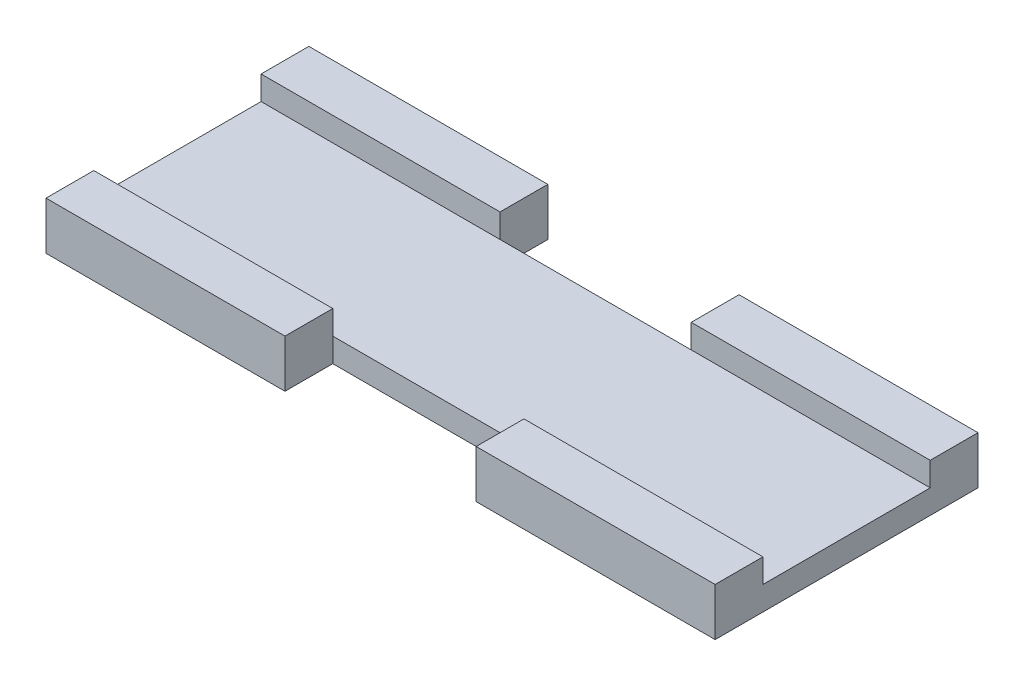
ISO-10303-21;
HEADER;
FILE_DESCRIPTION(('STEP AP214'),'2;1');
FILE_NAME('part.step','',(''),(''),'','','');
FILE_SCHEMA(('AUTOMOTIVE_DESIGN { 1 0 10303 214 1 1 1 1 }'));
ENDSEC;
DATA;
#1=APPLICATION_CONTEXT('core data for automotive mechanical design processes');
#2=APPLICATION_PROTOCOL_DEFINITION('international standard','automotive_design',2000,#1);
#3=PRODUCT_CONTEXT('',#1,'mechanical');
#4=PRODUCT('Part','Part','',(#3));
#5=PRODUCT_RELATED_PRODUCT_CATEGORY('part','',(#4));
#6=PRODUCT_DEFINITION_FORMATION('','',#4);
#7=PRODUCT_DEFINITION_CONTEXT('part definition',#1,'design');
#8=PRODUCT_DEFINITION('design','',#6,#7);
#9=PRODUCT_DEFINITION_SHAPE('','',#8);
#10=(LENGTH_UNIT() NAMED_UNIT(*) SI_UNIT(.MILLI.,.METRE.));
#11=(NAMED_UNIT(*) PLANE_ANGLE_UNIT() SI_UNIT($,.RADIAN.));
#12=(NAMED_UNIT(*) SI_UNIT($,.STERADIAN.) SOLID_ANGLE_UNIT());
#13=UNCERTAINTY_MEASURE_WITH_UNIT(LENGTH_MEASURE(1.E-05),#10,'distance_accuracy_value','');
#14=(GEOMETRIC_REPRESENTATION_CONTEXT(3) GLOBAL_UNCERTAINTY_ASSIGNED_CONTEXT((#13)) GLOBAL_UNIT_ASSIGNED_CONTEXT((#10,
#11,#12)) REPRESENTATION_CONTEXT('',''));
#15=CARTESIAN_POINT('',(0.,0.,0.));
#16=DIRECTION('',(0.,0.,1.));
#17=DIRECTION('',(1.,0.,0.));
#18=AXIS2_PLACEMENT_3D('',#15,#16,#17);
#19=CARTESIAN_POINT('',(0.,5.,17.5));
#20=DIRECTION('',(0.,0.,1.));
#21=DIRECTION('',(1.,0.,0.));
#22=AXIS2_PLACEMENT_3D('',#19,#20,#21);
#23=PLANE('',#22);
#24=DIRECTION('',(0.,-1.,0.));
#25=VECTOR('',#24,1.);
#26=CARTESIAN_POINT('',(20.,10.,17.5));
#27=LINE('',#26,#25);
#28=CARTESIAN_POINT('',(20.,5.,17.5));
#29=VERTEX_POINT('',#28);
#30=CARTESIAN_POINT('',(20.,0.,17.5));
#31=VERTEX_POINT('',#30);
#32=EDGE_CURVE('E192',#29,#31,#27,.T.);
#33=ORIENTED_EDGE('',*,*,#32,.F.);
#34=DIRECTION('',(-1.,0.,0.));
#35=VECTOR('',#34,1.);
#36=CARTESIAN_POINT('',(0.,5.,17.5));
#37=LINE('',#36,#35);
#38=CARTESIAN_POINT('',(-20.,5.,17.5));
#39=VERTEX_POINT('',#38);
#40=EDGE_CURVE('E284',#29,#39,#37,.T.);
#41=ORIENTED_EDGE('',*,*,#40,.T.);
#42=DIRECTION('',(0.,-1.,0.));
#43=VECTOR('',#42,1.);
#44=CARTESIAN_POINT('',(-20.,10.,17.5));
#45=LINE('',#44,#43);
#46=CARTESIAN_POINT('',(-20.,0.,17.5));
#47=VERTEX_POINT('',#46);
#48=EDGE_CURVE('E11',#39,#47,#45,.T.);
#49=ORIENTED_EDGE('',*,*,#48,.T.);
#50=DIRECTION('',(-1.,0.,0.));
#51=VECTOR('',#50,1.);
#52=CARTESIAN_POINT('',(0.,0.,17.5));
#53=LINE('',#52,#51);
#54=EDGE_CURVE('E59',#31,#47,#53,.T.);
#55=ORIENTED_EDGE('',*,*,#54,.F.);
#56=EDGE_LOOP('',(#33,#41,#49,#55));
#57=FACE_BOUND('',#56,.T.);
#58=ADVANCED_FACE('F37',(#57),#23,.T.);
#59=CARTESIAN_POINT('',(0.,5.,-17.5));
#60=DIRECTION('',(0.,0.,-1.));
#61=DIRECTION('',(-1.,0.,0.));
#62=AXIS2_PLACEMENT_3D('',#59,#60,#61);
#63=PLANE('',#62);
#64=DIRECTION('',(1.,0.,0.));
#65=VECTOR('',#64,1.);
#66=CARTESIAN_POINT('',(0.,5.,-17.5));
#67=LINE('',#66,#65);
#68=CARTESIAN_POINT('',(-20.,5.,-17.5));
#69=VERTEX_POINT('',#68);
#70=CARTESIAN_POINT('',(20.,5.,-17.5));
#71=VERTEX_POINT('',#70);
#72=EDGE_CURVE('E288',#69,#71,#67,.T.);
#73=ORIENTED_EDGE('',*,*,#72,.T.);
#74=DIRECTION('',(0.,-1.,0.));
#75=VECTOR('',#74,1.);
#76=CARTESIAN_POINT('',(20.,10.,-17.5));
#77=LINE('',#76,#75);
#78=CARTESIAN_POINT('',(20.,0.,-17.5));
#79=VERTEX_POINT('',#78);
#80=EDGE_CURVE('E243',#71,#79,#77,.T.);
#81=ORIENTED_EDGE('',*,*,#80,.T.);
#82=DIRECTION('',(1.,0.,0.));
#83=VECTOR('',#82,1.);
#84=CARTESIAN_POINT('',(0.,0.,-17.5));
#85=LINE('',#84,#83);
#86=CARTESIAN_POINT('',(-20.,0.,-17.5));
#87=VERTEX_POINT('',#86);
#88=EDGE_CURVE('E297',#87,#79,#85,.T.);
#89=ORIENTED_EDGE('',*,*,#88,.F.);
#90=DIRECTION('',(0.,-1.,0.));
#91=VECTOR('',#90,1.);
#92=CARTESIAN_POINT('',(-20.,10.,-17.5));
#93=LINE('',#92,#91);
#94=EDGE_CURVE('E45',#69,#87,#93,.T.);
#95=ORIENTED_EDGE('',*,*,#94,.F.);
#96=EDGE_LOOP('',(#73,#81,#89,#95));
#97=FACE_BOUND('',#96,.T.);
#98=ADVANCED_FACE('F340',(#97),#63,.T.);
#99=CARTESIAN_POINT('',(70.,5.,0.));
#100=DIRECTION('',(1.,0.,0.));
#101=DIRECTION('',(0.,0.,-1.));
#102=AXIS2_PLACEMENT_3D('',#99,#100,#101);
#103=PLANE('',#102);
#104=DIRECTION('',(0.,0.,1.));
#105=VECTOR('',#104,1.);
#106=CARTESIAN_POINT('',(70.,0.,0.));
#107=LINE('',#106,#105);
#108=CARTESIAN_POINT('',(70.,0.,-27.5));
#109=VERTEX_POINT('',#108);
#110=CARTESIAN_POINT('',(70.,0.,27.5));
#111=VERTEX_POINT('',#110);
#112=EDGE_CURVE('E296',#109,#111,#107,.T.);
#113=ORIENTED_EDGE('',*,*,#112,.F.);
#114=DIRECTION('',(0.,-1.,0.));
#115=VECTOR('',#114,1.);
#116=CARTESIAN_POINT('',(70.,10.,-27.5));
#117=LINE('',#116,#115);
#118=CARTESIAN_POINT('',(70.,10.,-27.5));
#119=VERTEX_POINT('',#118);
#120=EDGE_CURVE('E234',#119,#109,#117,.T.);
#121=ORIENTED_EDGE('',*,*,#120,.F.);
#122=DIRECTION('',(0.,0.,-1.));
#123=VECTOR('',#122,1.);
#124=CARTESIAN_POINT('',(70.,10.,0.));
#125=LINE('',#124,#123);
#126=CARTESIAN_POINT('',(70.,10.,-17.5));
#127=VERTEX_POINT('',#126);
#128=EDGE_CURVE('E232',#127,#119,#125,.T.);
#129=ORIENTED_EDGE('',*,*,#128,.F.);
#130=DIRECTION('',(0.,-1.,0.));
#131=VECTOR('',#130,1.);
#132=CARTESIAN_POINT('',(70.,10.,-17.5));
#133=LINE('',#132,#131);
#134=CARTESIAN_POINT('',(70.,5.,-17.5));
#135=VERTEX_POINT('',#134);
#136=EDGE_CURVE('E240',#127,#135,#133,.T.);
#137=ORIENTED_EDGE('',*,*,#136,.T.);
#138=DIRECTION('',(0.,0.,1.));
#139=VECTOR('',#138,1.);
#140=CARTESIAN_POINT('',(70.,5.,0.));
#141=LINE('',#140,#139);
#142=CARTESIAN_POINT('',(70.,5.,17.5));
#143=VERTEX_POINT('',#142);
#144=EDGE_CURVE('E283',#135,#143,#141,.T.);
#145=ORIENTED_EDGE('',*,*,#144,.T.);
#146=DIRECTION('',(0.,-1.,0.));
#147=VECTOR('',#146,1.);
#148=CARTESIAN_POINT('',(70.,10.,17.5));
#149=LINE('',#148,#147);
#150=CARTESIAN_POINT('',(70.,10.,17.5));
#151=VERTEX_POINT('',#150);
#152=EDGE_CURVE('E197',#151,#143,#149,.T.);
#153=ORIENTED_EDGE('',*,*,#152,.F.);
#154=DIRECTION('',(0.,0.,1.));
#155=VECTOR('',#154,1.);
#156=CARTESIAN_POINT('',(70.,10.,0.));
#157=LINE('',#156,#155);
#158=CARTESIAN_POINT('',(70.,10.,27.5));
#159=VERTEX_POINT('',#158);
#160=EDGE_CURVE('E187',#151,#159,#157,.T.);
#161=ORIENTED_EDGE('',*,*,#160,.T.);
#162=DIRECTION('',(0.,-1.,0.));
#163=VECTOR('',#162,1.);
#164=CARTESIAN_POINT('',(70.,10.,27.5));
#165=LINE('',#164,#163);
#166=EDGE_CURVE('E172',#159,#111,#165,.T.);
#167=ORIENTED_EDGE('',*,*,#166,.T.);
#168=EDGE_LOOP('',(#113,#121,#129,#137,#145,#153,#161,#167));
#169=FACE_BOUND('',#168,.T.);
#170=ADVANCED_FACE('F350',(#169),#103,.T.);
#171=CARTESIAN_POINT('',(-70.,5.,0.));
#172=DIRECTION('',(-1.,0.,0.));
#173=DIRECTION('',(0.,0.,1.));
#174=AXIS2_PLACEMENT_3D('',#171,#172,#173);
#175=PLANE('',#174);
#176=DIRECTION('',(0.,0.,-1.));
#177=VECTOR('',#176,1.);
#178=CARTESIAN_POINT('',(-70.,0.,0.));
#179=LINE('',#178,#177);
#180=CARTESIAN_POINT('',(-70.,0.,27.5));
#181=VERTEX_POINT('',#180);
#182=CARTESIAN_POINT('',(-70.,0.,-27.5));
#183=VERTEX_POINT('',#182);
#184=EDGE_CURVE('E40',#181,#183,#179,.T.);
#185=ORIENTED_EDGE('',*,*,#184,.F.);
#186=DIRECTION('',(0.,-1.,0.));
#187=VECTOR('',#186,1.);
#188=CARTESIAN_POINT('',(-70.,10.,27.5));
#189=LINE('',#188,#187);
#190=CARTESIAN_POINT('',(-70.,10.,27.5));
#191=VERTEX_POINT('',#190);
#192=EDGE_CURVE('E210',#191,#181,#189,.T.);
#193=ORIENTED_EDGE('',*,*,#192,.F.);
#194=DIRECTION('',(0.,0.,1.));
#195=VECTOR('',#194,1.);
#196=CARTESIAN_POINT('',(-70.,10.,0.));
#197=LINE('',#196,#195);
#198=CARTESIAN_POINT('',(-70.,10.,17.5));
#199=VERTEX_POINT('',#198);
#200=EDGE_CURVE('E208',#199,#191,#197,.T.);
#201=ORIENTED_EDGE('',*,*,#200,.F.);
#202=DIRECTION('',(0.,-1.,0.));
#203=VECTOR('',#202,1.);
#204=CARTESIAN_POINT('',(-70.,10.,17.5));
#205=LINE('',#204,#203);
#206=CARTESIAN_POINT('',(-70.,5.,17.5));
#207=VERTEX_POINT('',#206);
#208=EDGE_CURVE('E216',#199,#207,#205,.T.);
#209=ORIENTED_EDGE('',*,*,#208,.T.);
#210=DIRECTION('',(0.,0.,-1.));
#211=VECTOR('',#210,1.);
#212=CARTESIAN_POINT('',(-70.,5.,0.));
#213=LINE('',#212,#211);
#214=CARTESIAN_POINT('',(-70.,5.,-17.5));
#215=VERTEX_POINT('',#214);
#216=EDGE_CURVE('E292',#207,#215,#213,.T.);
#217=ORIENTED_EDGE('',*,*,#216,.T.);
#218=DIRECTION('',(0.,-1.,0.));
#219=VECTOR('',#218,1.);
#220=CARTESIAN_POINT('',(-70.,10.,-17.5));
#221=LINE('',#220,#219);
#222=CARTESIAN_POINT('',(-70.,10.,-17.5));
#223=VERTEX_POINT('',#222);
#224=EDGE_CURVE('E273',#223,#215,#221,.T.);
#225=ORIENTED_EDGE('',*,*,#224,.F.);
#226=DIRECTION('',(0.,0.,-1.));
#227=VECTOR('',#226,1.);
#228=CARTESIAN_POINT('',(-70.,10.,0.));
#229=LINE('',#228,#227);
#230=CARTESIAN_POINT('',(-70.,10.,-27.5));
#231=VERTEX_POINT('',#230);
#232=EDGE_CURVE('E261',#223,#231,#229,.T.);
#233=ORIENTED_EDGE('',*,*,#232,.T.);
#234=DIRECTION('',(0.,-1.,0.));
#235=VECTOR('',#234,1.);
#236=CARTESIAN_POINT('',(-70.,10.,-27.5));
#237=LINE('',#236,#235);
#238=EDGE_CURVE('E276',#231,#183,#237,.T.);
#239=ORIENTED_EDGE('',*,*,#238,.T.);
#240=EDGE_LOOP('',(#185,#193,#201,#209,#217,#225,#233,#239));
#241=FACE_BOUND('',#240,.T.);
#242=ADVANCED_FACE('F318',(#241),#175,.T.);
#243=CARTESIAN_POINT('',(0.,5.,0.));
#244=DIRECTION('',(0.,1.,0.));
#245=DIRECTION('',(0.,0.,1.));
#246=AXIS2_PLACEMENT_3D('',#243,#244,#245);
#247=PLANE('',#246);
#248=EDGE_CURVE('E281',#143,#29,#37,.T.);
#249=ORIENTED_EDGE('',*,*,#248,.F.);
#250=ORIENTED_EDGE('',*,*,#144,.F.);
#251=DIRECTION('',(-1.,0.,0.));
#252=VECTOR('',#251,1.);
#253=CARTESIAN_POINT('',(0.,5.,-17.5));
#254=LINE('',#253,#252);
#255=EDGE_CURVE('E250',#135,#71,#254,.T.);
#256=ORIENTED_EDGE('',*,*,#255,.T.);
#257=ORIENTED_EDGE('',*,*,#72,.F.);
#258=EDGE_CURVE('E289',#215,#69,#67,.T.);
#259=ORIENTED_EDGE('',*,*,#258,.F.);
#260=ORIENTED_EDGE('',*,*,#216,.F.);
#261=EDGE_CURVE('E285',#39,#207,#37,.T.);
#262=ORIENTED_EDGE('',*,*,#261,.F.);
#263=ORIENTED_EDGE('',*,*,#40,.F.);
#264=EDGE_LOOP('',(#249,#250,#256,#257,#259,#260,#262,#263));
#265=FACE_BOUND('',#264,.T.);
#266=ADVANCED_FACE('F315',(#265),#247,.T.);
#267=CARTESIAN_POINT('',(0.,0.,0.));
#268=DIRECTION('',(0.,1.,0.));
#269=DIRECTION('',(0.,0.,1.));
#270=AXIS2_PLACEMENT_3D('',#267,#268,#269);
#271=PLANE('',#270);
#272=ORIENTED_EDGE('',*,*,#112,.T.);
#273=DIRECTION('',(-1.,0.,0.));
#274=VECTOR('',#273,1.);
#275=CARTESIAN_POINT('',(0.,0.,27.5));
#276=LINE('',#275,#274);
#277=CARTESIAN_POINT('',(20.,0.,27.5));
#278=VERTEX_POINT('',#277);
#279=EDGE_CURVE('E183',#111,#278,#276,.T.);
#280=ORIENTED_EDGE('',*,*,#279,.T.);
#281=DIRECTION('',(0.,0.,-1.));
#282=VECTOR('',#281,1.);
#283=CARTESIAN_POINT('',(20.,0.,0.));
#284=LINE('',#283,#282);
#285=EDGE_CURVE('E54',#278,#31,#284,.T.);
#286=ORIENTED_EDGE('',*,*,#285,.T.);
#287=ORIENTED_EDGE('',*,*,#54,.T.);
#288=DIRECTION('',(0.,0.,-1.));
#289=VECTOR('',#288,1.);
#290=CARTESIAN_POINT('',(-20.,0.,0.));
#291=LINE('',#290,#289);
#292=CARTESIAN_POINT('',(-20.,0.,27.5));
#293=VERTEX_POINT('',#292);
#294=EDGE_CURVE('E204',#293,#47,#291,.T.);
#295=ORIENTED_EDGE('',*,*,#294,.F.);
#296=DIRECTION('',(1.,0.,0.));
#297=VECTOR('',#296,1.);
#298=CARTESIAN_POINT('',(0.,0.,27.5));
#299=LINE('',#298,#297);
#300=EDGE_CURVE('E171',#181,#293,#299,.T.);
#301=ORIENTED_EDGE('',*,*,#300,.F.);
#302=ORIENTED_EDGE('',*,*,#184,.T.);
#303=DIRECTION('',(1.,0.,0.));
#304=VECTOR('',#303,1.);
#305=CARTESIAN_POINT('',(0.,0.,-27.5));
#306=LINE('',#305,#304);
#307=CARTESIAN_POINT('',(-20.,0.,-27.5));
#308=VERTEX_POINT('',#307);
#309=EDGE_CURVE('E258',#183,#308,#306,.T.);
#310=ORIENTED_EDGE('',*,*,#309,.T.);
#311=DIRECTION('',(0.,0.,1.));
#312=VECTOR('',#311,1.);
#313=CARTESIAN_POINT('',(-20.,0.,0.));
#314=LINE('',#313,#312);
#315=EDGE_CURVE('E253',#308,#87,#314,.T.);
#316=ORIENTED_EDGE('',*,*,#315,.T.);
#317=ORIENTED_EDGE('',*,*,#88,.T.);
#318=DIRECTION('',(0.,0.,1.));
#319=VECTOR('',#318,1.);
#320=CARTESIAN_POINT('',(20.,0.,0.));
#321=LINE('',#320,#319);
#322=CARTESIAN_POINT('',(20.,0.,-27.5));
#323=VERTEX_POINT('',#322);
#324=EDGE_CURVE('E228',#323,#79,#321,.T.);
#325=ORIENTED_EDGE('',*,*,#324,.F.);
#326=DIRECTION('',(-1.,0.,0.));
#327=VECTOR('',#326,1.);
#328=CARTESIAN_POINT('',(0.,0.,-27.5));
#329=LINE('',#328,#327);
#330=EDGE_CURVE('E223',#109,#323,#329,.T.);
#331=ORIENTED_EDGE('',*,*,#330,.F.);
#332=EDGE_LOOP('',(#272,#280,#286,#287,#295,#301,#302,#310,#316,#317,#325,#331));
#333=FACE_BOUND('',#332,.T.);
#334=ADVANCED_FACE('F334',(#333),#271,.F.);
#335=CARTESIAN_POINT('',(0.,10.,-17.5));
#336=DIRECTION('',(0.,0.,-1.));
#337=DIRECTION('',(-1.,0.,0.));
#338=AXIS2_PLACEMENT_3D('',#335,#336,#337);
#339=PLANE('',#338);
#340=ORIENTED_EDGE('',*,*,#224,.T.);
#341=ORIENTED_EDGE('',*,*,#258,.T.);
#342=CARTESIAN_POINT('',(-20.,10.,-17.5));
#343=VERTEX_POINT('',#342);
#344=EDGE_CURVE('E266',#343,#69,#93,.T.);
#345=ORIENTED_EDGE('',*,*,#344,.F.);
#346=DIRECTION('',(1.,0.,0.));
#347=VECTOR('',#346,1.);
#348=CARTESIAN_POINT('',(0.,10.,-17.5));
#349=LINE('',#348,#347);
#350=EDGE_CURVE('E264',#223,#343,#349,.T.);
#351=ORIENTED_EDGE('',*,*,#350,.F.);
#352=EDGE_LOOP('',(#340,#341,#345,#351));
#353=FACE_BOUND('',#352,.T.);
#354=ADVANCED_FACE('F322',(#353),#339,.F.);
#355=CARTESIAN_POINT('',(-20.,10.,0.));
#356=DIRECTION('',(1.,0.,0.));
#357=DIRECTION('',(0.,0.,-1.));
#358=AXIS2_PLACEMENT_3D('',#355,#356,#357);
#359=PLANE('',#358);
#360=ORIENTED_EDGE('',*,*,#315,.F.);
#361=DIRECTION('',(0.,-1.,0.));
#362=VECTOR('',#361,1.);
#363=CARTESIAN_POINT('',(-20.,10.,-27.5));
#364=LINE('',#363,#362);
#365=CARTESIAN_POINT('',(-20.,10.,-27.5));
#366=VERTEX_POINT('',#365);
#367=EDGE_CURVE('E279',#366,#308,#364,.T.);
#368=ORIENTED_EDGE('',*,*,#367,.F.);
#369=DIRECTION('',(0.,0.,1.));
#370=VECTOR('',#369,1.);
#371=CARTESIAN_POINT('',(-20.,10.,0.));
#372=LINE('',#371,#370);
#373=EDGE_CURVE('E254',#366,#343,#372,.T.);
#374=ORIENTED_EDGE('',*,*,#373,.T.);
#375=ORIENTED_EDGE('',*,*,#344,.T.);
#376=ORIENTED_EDGE('',*,*,#94,.T.);
#377=EDGE_LOOP('',(#360,#368,#374,#375,#376));
#378=FACE_BOUND('',#377,.T.);
#379=ADVANCED_FACE('F337',(#378),#359,.T.);
#380=CARTESIAN_POINT('',(0.,10.,-27.5));
#381=DIRECTION('',(0.,0.,-1.));
#382=DIRECTION('',(-1.,0.,0.));
#383=AXIS2_PLACEMENT_3D('',#380,#381,#382);
#384=PLANE('',#383);
#385=ORIENTED_EDGE('',*,*,#309,.F.);
#386=ORIENTED_EDGE('',*,*,#238,.F.);
#387=DIRECTION('',(1.,0.,0.));
#388=VECTOR('',#387,1.);
#389=CARTESIAN_POINT('',(0.,10.,-27.5));
#390=LINE('',#389,#388);
#391=EDGE_CURVE('E257',#231,#366,#390,.T.);
#392=ORIENTED_EDGE('',*,*,#391,.T.);
#393=ORIENTED_EDGE('',*,*,#367,.T.);
#394=EDGE_LOOP('',(#385,#386,#392,#393));
#395=FACE_BOUND('',#394,.T.);
#396=ADVANCED_FACE('F332',(#395),#384,.T.);
#397=CARTESIAN_POINT('',(0.,10.,0.));
#398=DIRECTION('',(0.,1.,0.));
#399=DIRECTION('',(0.,0.,1.));
#400=AXIS2_PLACEMENT_3D('',#397,#398,#399);
#401=PLANE('',#400);
#402=ORIENTED_EDGE('',*,*,#373,.F.);
#403=ORIENTED_EDGE('',*,*,#391,.F.);
#404=ORIENTED_EDGE('',*,*,#232,.F.);
#405=ORIENTED_EDGE('',*,*,#350,.T.);
#406=EDGE_LOOP('',(#402,#403,#404,#405));
#407=FACE_BOUND('',#406,.T.);
#408=ADVANCED_FACE('F328',(#407),#401,.T.);
#409=CARTESIAN_POINT('',(0.,10.,-27.5));
#410=DIRECTION('',(0.,0.,1.));
#411=DIRECTION('',(1.,0.,0.));
#412=AXIS2_PLACEMENT_3D('',#409,#410,#411);
#413=PLANE('',#412);
#414=ORIENTED_EDGE('',*,*,#330,.T.);
#415=DIRECTION('',(0.,-1.,0.));
#416=VECTOR('',#415,1.);
#417=CARTESIAN_POINT('',(20.,10.,-27.5));
#418=LINE('',#417,#416);
#419=CARTESIAN_POINT('',(20.,10.,-27.5));
#420=VERTEX_POINT('',#419);
#421=EDGE_CURVE('E247',#420,#323,#418,.T.);
#422=ORIENTED_EDGE('',*,*,#421,.F.);
#423=DIRECTION('',(-1.,0.,0.));
#424=VECTOR('',#423,1.);
#425=CARTESIAN_POINT('',(0.,10.,-27.5));
#426=LINE('',#425,#424);
#427=EDGE_CURVE('E224',#119,#420,#426,.T.);
#428=ORIENTED_EDGE('',*,*,#427,.F.);
#429=ORIENTED_EDGE('',*,*,#120,.T.);
#430=EDGE_LOOP('',(#414,#422,#428,#429));
#431=FACE_BOUND('',#430,.T.);
#432=ADVANCED_FACE('F360',(#431),#413,.F.);
#433=CARTESIAN_POINT('',(20.,10.,0.));
#434=DIRECTION('',(1.,0.,0.));
#435=DIRECTION('',(0.,0.,-1.));
#436=AXIS2_PLACEMENT_3D('',#433,#434,#435);
#437=PLANE('',#436);
#438=ORIENTED_EDGE('',*,*,#324,.T.);
#439=ORIENTED_EDGE('',*,*,#80,.F.);
#440=CARTESIAN_POINT('',(20.,10.,-17.5));
#441=VERTEX_POINT('',#440);
#442=EDGE_CURVE('E244',#441,#71,#77,.T.);
#443=ORIENTED_EDGE('',*,*,#442,.F.);
#444=DIRECTION('',(0.,0.,1.));
#445=VECTOR('',#444,1.);
#446=CARTESIAN_POINT('',(20.,10.,0.));
#447=LINE('',#446,#445);
#448=EDGE_CURVE('E227',#420,#441,#447,.T.);
#449=ORIENTED_EDGE('',*,*,#448,.F.);
#450=ORIENTED_EDGE('',*,*,#421,.T.);
#451=EDGE_LOOP('',(#438,#439,#443,#449,#450));
#452=FACE_BOUND('',#451,.T.);
#453=ADVANCED_FACE('F357',(#452),#437,.F.);
#454=CARTESIAN_POINT('',(0.,10.,-17.5));
#455=DIRECTION('',(0.,0.,-1.));
#456=DIRECTION('',(-1.,0.,0.));
#457=AXIS2_PLACEMENT_3D('',#454,#455,#456);
#458=PLANE('',#457);
#459=ORIENTED_EDGE('',*,*,#255,.F.);
#460=ORIENTED_EDGE('',*,*,#136,.F.);
#461=DIRECTION('',(1.,0.,0.));
#462=VECTOR('',#461,1.);
#463=CARTESIAN_POINT('',(0.,10.,-17.5));
#464=LINE('',#463,#462);
#465=EDGE_CURVE('E230',#441,#127,#464,.T.);
#466=ORIENTED_EDGE('',*,*,#465,.F.);
#467=ORIENTED_EDGE('',*,*,#442,.T.);
#468=EDGE_LOOP('',(#459,#460,#466,#467));
#469=FACE_BOUND('',#468,.T.);
#470=ADVANCED_FACE('F345',(#469),#458,.F.);
#471=CARTESIAN_POINT('',(0.,10.,0.));
#472=DIRECTION('',(0.,1.,0.));
#473=DIRECTION('',(0.,0.,1.));
#474=AXIS2_PLACEMENT_3D('',#471,#472,#473);
#475=PLANE('',#474);
#476=ORIENTED_EDGE('',*,*,#427,.T.);
#477=ORIENTED_EDGE('',*,*,#448,.T.);
#478=ORIENTED_EDGE('',*,*,#465,.T.);
#479=ORIENTED_EDGE('',*,*,#128,.T.);
#480=EDGE_LOOP('',(#476,#477,#478,#479));
#481=FACE_BOUND('',#480,.T.);
#482=ADVANCED_FACE('F354',(#481),#475,.T.);
#483=CARTESIAN_POINT('',(0.,10.,17.5));
#484=DIRECTION('',(0.,0.,1.));
#485=DIRECTION('',(1.,0.,0.));
#486=AXIS2_PLACEMENT_3D('',#483,#484,#485);
#487=PLANE('',#486);
#488=CARTESIAN_POINT('',(-20.,10.,17.5));
#489=VERTEX_POINT('',#488);
#490=EDGE_CURVE('E47',#489,#39,#45,.T.);
#491=ORIENTED_EDGE('',*,*,#490,.T.);
#492=ORIENTED_EDGE('',*,*,#261,.T.);
#493=ORIENTED_EDGE('',*,*,#208,.F.);
#494=DIRECTION('',(-1.,0.,0.));
#495=VECTOR('',#494,1.);
#496=CARTESIAN_POINT('',(0.,10.,17.5));
#497=LINE('',#496,#495);
#498=EDGE_CURVE('E206',#489,#199,#497,.T.);
#499=ORIENTED_EDGE('',*,*,#498,.F.);
#500=EDGE_LOOP('',(#491,#492,#493,#499));
#501=FACE_BOUND('',#500,.T.);
#502=ADVANCED_FACE('F313',(#501),#487,.F.);
#503=CARTESIAN_POINT('',(0.,10.,27.5));
#504=DIRECTION('',(0.,0.,-1.));
#505=DIRECTION('',(-1.,0.,0.));
#506=AXIS2_PLACEMENT_3D('',#503,#504,#505);
#507=PLANE('',#506);
#508=ORIENTED_EDGE('',*,*,#300,.T.);
#509=DIRECTION('',(0.,-1.,0.));
#510=VECTOR('',#509,1.);
#511=CARTESIAN_POINT('',(-20.,10.,27.5));
#512=LINE('',#511,#510);
#513=CARTESIAN_POINT('',(-20.,10.,27.5));
#514=VERTEX_POINT('',#513);
#515=EDGE_CURVE('E220',#514,#293,#512,.T.);
#516=ORIENTED_EDGE('',*,*,#515,.F.);
#517=DIRECTION('',(1.,0.,0.));
#518=VECTOR('',#517,1.);
#519=CARTESIAN_POINT('',(0.,10.,27.5));
#520=LINE('',#519,#518);
#521=EDGE_CURVE('E200',#191,#514,#520,.T.);
#522=ORIENTED_EDGE('',*,*,#521,.F.);
#523=ORIENTED_EDGE('',*,*,#192,.T.);
#524=EDGE_LOOP('',(#508,#516,#522,#523));
#525=FACE_BOUND('',#524,.T.);
#526=ADVANCED_FACE('F442',(#525),#507,.F.);
#527=CARTESIAN_POINT('',(-20.,10.,0.));
#528=DIRECTION('',(-1.,0.,0.));
#529=DIRECTION('',(0.,0.,1.));
#530=AXIS2_PLACEMENT_3D('',#527,#528,#529);
#531=PLANE('',#530);
#532=ORIENTED_EDGE('',*,*,#294,.T.);
#533=ORIENTED_EDGE('',*,*,#48,.F.);
#534=ORIENTED_EDGE('',*,*,#490,.F.);
#535=DIRECTION('',(0.,0.,-1.));
#536=VECTOR('',#535,1.);
#537=CARTESIAN_POINT('',(-20.,10.,0.));
#538=LINE('',#537,#536);
#539=EDGE_CURVE('E203',#514,#489,#538,.T.);
#540=ORIENTED_EDGE('',*,*,#539,.F.);
#541=ORIENTED_EDGE('',*,*,#515,.T.);
#542=EDGE_LOOP('',(#532,#533,#534,#540,#541));
#543=FACE_BOUND('',#542,.T.);
#544=ADVANCED_FACE('F311',(#543),#531,.F.);
#545=CARTESIAN_POINT('',(0.,10.,0.));
#546=DIRECTION('',(0.,1.,0.));
#547=DIRECTION('',(0.,0.,1.));
#548=AXIS2_PLACEMENT_3D('',#545,#546,#547);
#549=PLANE('',#548);
#550=ORIENTED_EDGE('',*,*,#521,.T.);
#551=ORIENTED_EDGE('',*,*,#539,.T.);
#552=ORIENTED_EDGE('',*,*,#498,.T.);
#553=ORIENTED_EDGE('',*,*,#200,.T.);
#554=EDGE_LOOP('',(#550,#551,#552,#553));
#555=FACE_BOUND('',#554,.T.);
#556=ADVANCED_FACE('F460',(#555),#549,.T.);
#557=CARTESIAN_POINT('',(20.,10.,0.));
#558=DIRECTION('',(-1.,0.,0.));
#559=DIRECTION('',(0.,0.,1.));
#560=AXIS2_PLACEMENT_3D('',#557,#558,#559);
#561=PLANE('',#560);
#562=ORIENTED_EDGE('',*,*,#285,.F.);
#563=DIRECTION('',(0.,-1.,0.));
#564=VECTOR('',#563,1.);
#565=CARTESIAN_POINT('',(20.,10.,27.5));
#566=LINE('',#565,#564);
#567=CARTESIAN_POINT('',(20.,10.,27.5));
#568=VERTEX_POINT('',#567);
#569=EDGE_CURVE('E163',#568,#278,#566,.T.);
#570=ORIENTED_EDGE('',*,*,#569,.F.);
#571=DIRECTION('',(0.,0.,-1.));
#572=VECTOR('',#571,1.);
#573=CARTESIAN_POINT('',(20.,10.,0.));
#574=LINE('',#573,#572);
#575=CARTESIAN_POINT('',(20.,10.,17.5));
#576=VERTEX_POINT('',#575);
#577=EDGE_CURVE('E167',#568,#576,#574,.T.);
#578=ORIENTED_EDGE('',*,*,#577,.T.);
#579=EDGE_CURVE('E195',#576,#29,#27,.T.);
#580=ORIENTED_EDGE('',*,*,#579,.T.);
#581=ORIENTED_EDGE('',*,*,#32,.T.);
#582=EDGE_LOOP('',(#562,#570,#578,#580,#581));
#583=FACE_BOUND('',#582,.T.);
#584=ADVANCED_FACE('F165',(#583),#561,.T.);
#585=CARTESIAN_POINT('',(0.,10.,27.5));
#586=DIRECTION('',(0.,0.,1.));
#587=DIRECTION('',(1.,0.,0.));
#588=AXIS2_PLACEMENT_3D('',#585,#586,#587);
#589=PLANE('',#588);
#590=ORIENTED_EDGE('',*,*,#279,.F.);
#591=ORIENTED_EDGE('',*,*,#166,.F.);
#592=DIRECTION('',(-1.,0.,0.));
#593=VECTOR('',#592,1.);
#594=CARTESIAN_POINT('',(0.,10.,27.5));
#595=LINE('',#594,#593);
#596=EDGE_CURVE('E178',#159,#568,#595,.T.);
#597=ORIENTED_EDGE('',*,*,#596,.T.);
#598=ORIENTED_EDGE('',*,*,#569,.T.);
#599=EDGE_LOOP('',(#590,#591,#597,#598));
#600=FACE_BOUND('',#599,.T.);
#601=ADVANCED_FACE('F185',(#600),#589,.T.);
#602=CARTESIAN_POINT('',(0.,10.,17.5));
#603=DIRECTION('',(0.,0.,1.));
#604=DIRECTION('',(1.,0.,0.));
#605=AXIS2_PLACEMENT_3D('',#602,#603,#604);
#606=PLANE('',#605);
#607=ORIENTED_EDGE('',*,*,#248,.T.);
#608=ORIENTED_EDGE('',*,*,#579,.F.);
#609=DIRECTION('',(-1.,0.,0.));
#610=VECTOR('',#609,1.);
#611=CARTESIAN_POINT('',(0.,10.,17.5));
#612=LINE('',#611,#610);
#613=EDGE_CURVE('E181',#151,#576,#612,.T.);
#614=ORIENTED_EDGE('',*,*,#613,.F.);
#615=ORIENTED_EDGE('',*,*,#152,.T.);
#616=EDGE_LOOP('',(#607,#608,#614,#615));
#617=FACE_BOUND('',#616,.T.);
#618=ADVANCED_FACE('F486',(#617),#606,.F.);
#619=CARTESIAN_POINT('',(0.,10.,0.));
#620=DIRECTION('',(0.,1.,0.));
#621=DIRECTION('',(0.,0.,1.));
#622=AXIS2_PLACEMENT_3D('',#619,#620,#621);
#623=PLANE('',#622);
#624=ORIENTED_EDGE('',*,*,#577,.F.);
#625=ORIENTED_EDGE('',*,*,#596,.F.);
#626=ORIENTED_EDGE('',*,*,#160,.F.);
#627=ORIENTED_EDGE('',*,*,#613,.T.);
#628=EDGE_LOOP('',(#624,#625,#626,#627));
#629=FACE_BOUND('',#628,.T.);
#630=ADVANCED_FACE('F176',(#629),#623,.T.);
#631=CLOSED_SHELL('',(#58,#98,#170,#242,#266,#334,#354,#379,#396,#408,#432,#453,#470,#482,#502,
#526,#544,#556,#584,#601,#618,#630));
#632=MANIFOLD_SOLID_BREP('B2',#631);
#633=ADVANCED_BREP_SHAPE_REPRESENTATION('',(#18,#632),#14);
#634=SHAPE_DEFINITION_REPRESENTATION(#9,#633);
ENDSEC;
END-ISO-10303-21;
